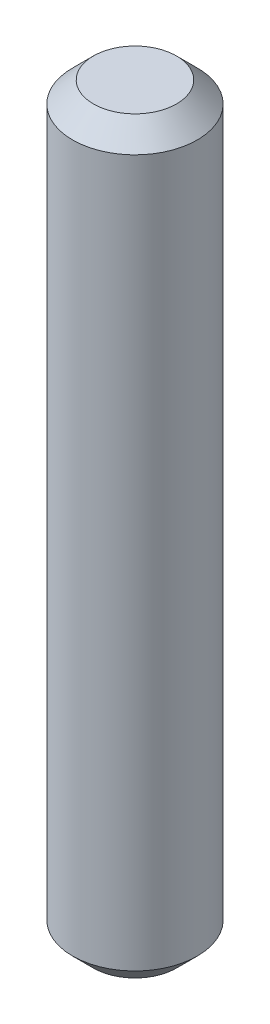
ISO-10303-21;
HEADER;
FILE_DESCRIPTION(('STEP AP214'),'2;1');
FILE_NAME('part.step','',(''),(''),'','','');
FILE_SCHEMA(('AUTOMOTIVE_DESIGN { 1 0 10303 214 1 1 1 1 }'));
ENDSEC;
DATA;
#1=APPLICATION_CONTEXT('core data for automotive mechanical design processes');
#2=APPLICATION_PROTOCOL_DEFINITION('international standard','automotive_design',2000,#1);
#3=PRODUCT_CONTEXT('',#1,'mechanical');
#4=PRODUCT('Part','Part','',(#3));
#5=PRODUCT_RELATED_PRODUCT_CATEGORY('part','',(#4));
#6=PRODUCT_DEFINITION_FORMATION('','',#4);
#7=PRODUCT_DEFINITION_CONTEXT('part definition',#1,'design');
#8=PRODUCT_DEFINITION('design','',#6,#7);
#9=PRODUCT_DEFINITION_SHAPE('','',#8);
#10=(LENGTH_UNIT() NAMED_UNIT(*) SI_UNIT(.MILLI.,.METRE.));
#11=(NAMED_UNIT(*) PLANE_ANGLE_UNIT() SI_UNIT($,.RADIAN.));
#12=(NAMED_UNIT(*) SI_UNIT($,.STERADIAN.) SOLID_ANGLE_UNIT());
#13=UNCERTAINTY_MEASURE_WITH_UNIT(LENGTH_MEASURE(1.E-05),#10,'distance_accuracy_value','');
#14=(GEOMETRIC_REPRESENTATION_CONTEXT(3) GLOBAL_UNCERTAINTY_ASSIGNED_CONTEXT((#13)) GLOBAL_UNIT_ASSIGNED_CONTEXT((#10,
#11,#12)) REPRESENTATION_CONTEXT('',''));
#15=CARTESIAN_POINT('',(0.,0.,0.));
#16=DIRECTION('',(0.,0.,1.));
#17=DIRECTION('',(1.,0.,0.));
#18=AXIS2_PLACEMENT_3D('',#15,#16,#17);
#19=CARTESIAN_POINT('',(0.,18.,0.));
#20=DIRECTION('',(0.,-1.,0.));
#21=DIRECTION('',(0.,0.,-1.));
#22=AXIS2_PLACEMENT_3D('',#19,#20,#21);
#23=CYLINDRICAL_SURFACE('',#22,1.5);
#24=CARTESIAN_POINT('',(0.,0.499999999999997,0.));
#25=DIRECTION('',(0.,1.,0.));
#26=DIRECTION('',(0.,0.,1.));
#27=AXIS2_PLACEMENT_3D('',#24,#25,#26);
#28=CIRCLE('',#27,1.5);
#29=CARTESIAN_POINT('',(0.,0.499999999999997,1.5));
#30=VERTEX_POINT('',#29);
#31=EDGE_CURVE('E46',#30,#30,#28,.T.);
#32=ORIENTED_EDGE('',*,*,#31,.T.);
#33=EDGE_LOOP('',(#32));
#34=FACE_BOUND('',#33,.T.);
#35=CARTESIAN_POINT('',(0.,17.5,0.));
#36=DIRECTION('',(0.,1.,0.));
#37=DIRECTION('',(0.,0.,1.));
#38=AXIS2_PLACEMENT_3D('',#35,#36,#37);
#39=CIRCLE('',#38,1.5);
#40=CARTESIAN_POINT('',(0.,17.5,1.5));
#41=VERTEX_POINT('',#40);
#42=EDGE_CURVE('E50',#41,#41,#39,.F.);
#43=ORIENTED_EDGE('',*,*,#42,.T.);
#44=EDGE_LOOP('',(#43));
#45=FACE_BOUND('',#44,.T.);
#46=ADVANCED_FACE('F35',(#34,#45),#23,.T.);
#47=CARTESIAN_POINT('',(0.,18.,0.));
#48=DIRECTION('',(0.,1.,0.));
#49=DIRECTION('',(0.,0.,1.));
#50=AXIS2_PLACEMENT_3D('',#47,#48,#49);
#51=PLANE('',#50);
#52=CARTESIAN_POINT('',(0.,18.,0.));
#53=DIRECTION('',(0.,1.,0.));
#54=DIRECTION('',(0.,0.,1.));
#55=AXIS2_PLACEMENT_3D('',#52,#53,#54);
#56=CIRCLE('',#55,1.);
#57=CARTESIAN_POINT('',(0.,18.,1.));
#58=VERTEX_POINT('',#57);
#59=EDGE_CURVE('E10',#58,#58,#56,.T.);
#60=ORIENTED_EDGE('',*,*,#59,.T.);
#61=EDGE_LOOP('',(#60));
#62=FACE_BOUND('',#61,.T.);
#63=ADVANCED_FACE('F66',(#62),#51,.T.);
#64=CARTESIAN_POINT('',(0.,0.,0.));
#65=DIRECTION('',(0.,1.,0.));
#66=DIRECTION('',(0.,0.,1.));
#67=AXIS2_PLACEMENT_3D('',#64,#65,#66);
#68=PLANE('',#67);
#69=CARTESIAN_POINT('',(0.,0.,0.));
#70=DIRECTION('',(0.,1.,0.));
#71=DIRECTION('',(0.,0.,1.));
#72=AXIS2_PLACEMENT_3D('',#69,#70,#71);
#73=CIRCLE('',#72,1.);
#74=CARTESIAN_POINT('',(0.,0.,1.));
#75=VERTEX_POINT('',#74);
#76=EDGE_CURVE('E42',#75,#75,#73,.F.);
#77=ORIENTED_EDGE('',*,*,#76,.T.);
#78=EDGE_LOOP('',(#77));
#79=FACE_BOUND('',#78,.T.);
#80=ADVANCED_FACE('F63',(#79),#68,.F.);
#81=CARTESIAN_POINT('',(0.,0.499999999999997,0.));
#82=DIRECTION('',(0.,1.,0.));
#83=DIRECTION('',(0.,0.,1.));
#84=AXIS2_PLACEMENT_3D('',#81,#82,#83);
#85=CONICAL_SURFACE('',#84,1.5,0.78539816339745);
#86=ORIENTED_EDGE('',*,*,#76,.F.);
#87=EDGE_LOOP('',(#86));
#88=FACE_BOUND('',#87,.T.);
#89=ORIENTED_EDGE('',*,*,#31,.F.);
#90=EDGE_LOOP('',(#89));
#91=FACE_BOUND('',#90,.T.);
#92=ADVANCED_FACE('F59',(#88,#91),#85,.T.);
#93=CARTESIAN_POINT('',(0.,18.,0.));
#94=DIRECTION('',(0.,-1.,0.));
#95=DIRECTION('',(0.,0.,-1.));
#96=AXIS2_PLACEMENT_3D('',#93,#94,#95);
#97=CONICAL_SURFACE('',#96,1.,0.785398163397447);
#98=ORIENTED_EDGE('',*,*,#42,.F.);
#99=EDGE_LOOP('',(#98));
#100=FACE_BOUND('',#99,.T.);
#101=ORIENTED_EDGE('',*,*,#59,.F.);
#102=EDGE_LOOP('',(#101));
#103=FACE_BOUND('',#102,.T.);
#104=ADVANCED_FACE('F37',(#100,#103),#97,.T.);
#105=CLOSED_SHELL('',(#46,#63,#80,#92,#104));
#106=MANIFOLD_SOLID_BREP('B2',#105);
#107=ADVANCED_BREP_SHAPE_REPRESENTATION('',(#18,#106),#14);
#108=SHAPE_DEFINITION_REPRESENTATION(#9,#107);
ENDSEC;
END-ISO-10303-21;
